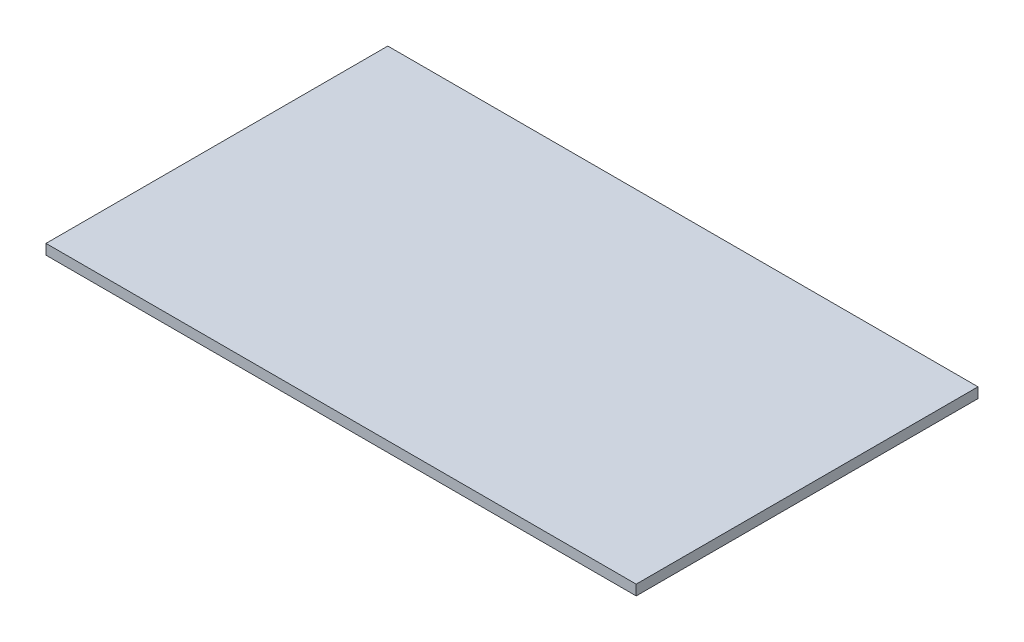
ISO-10303-21;
HEADER;
FILE_DESCRIPTION(('STEP AP214'),'2;1');
FILE_NAME('part.step','',(''),(''),'','','');
FILE_SCHEMA(('AUTOMOTIVE_DESIGN { 1 0 10303 214 1 1 1 1 }'));
ENDSEC;
DATA;
#1=APPLICATION_CONTEXT('core data for automotive mechanical design processes');
#2=APPLICATION_PROTOCOL_DEFINITION('international standard','automotive_design',2000,#1);
#3=PRODUCT_CONTEXT('',#1,'mechanical');
#4=PRODUCT('Part','Part','',(#3));
#5=PRODUCT_RELATED_PRODUCT_CATEGORY('part','',(#4));
#6=PRODUCT_DEFINITION_FORMATION('','',#4);
#7=PRODUCT_DEFINITION_CONTEXT('part definition',#1,'design');
#8=PRODUCT_DEFINITION('design','',#6,#7);
#9=PRODUCT_DEFINITION_SHAPE('','',#8);
#10=(LENGTH_UNIT() NAMED_UNIT(*) SI_UNIT(.MILLI.,.METRE.));
#11=(NAMED_UNIT(*) PLANE_ANGLE_UNIT() SI_UNIT($,.RADIAN.));
#12=(NAMED_UNIT(*) SI_UNIT($,.STERADIAN.) SOLID_ANGLE_UNIT());
#13=UNCERTAINTY_MEASURE_WITH_UNIT(LENGTH_MEASURE(1.E-05),#10,'distance_accuracy_value','');
#14=(GEOMETRIC_REPRESENTATION_CONTEXT(3) GLOBAL_UNCERTAINTY_ASSIGNED_CONTEXT((#13)) GLOBAL_UNIT_ASSIGNED_CONTEXT((#10,
#11,#12)) REPRESENTATION_CONTEXT('',''));
#15=CARTESIAN_POINT('',(0.,0.,0.));
#16=DIRECTION('',(0.,0.,1.));
#17=DIRECTION('',(1.,0.,0.));
#18=AXIS2_PLACEMENT_3D('',#15,#16,#17);
#19=CARTESIAN_POINT('',(518.,18.,-300.));
#20=DIRECTION('',(-1.,0.,0.));
#21=DIRECTION('',(0.,0.,1.));
#22=AXIS2_PLACEMENT_3D('',#19,#20,#21);
#23=PLANE('',#22);
#24=DIRECTION('',(0.,0.,-1.));
#25=VECTOR('',#24,1.);
#26=CARTESIAN_POINT('',(518.,0.,-300.));
#27=LINE('',#26,#25);
#28=CARTESIAN_POINT('',(518.,0.,300.));
#29=VERTEX_POINT('',#28);
#30=CARTESIAN_POINT('',(518.,0.,-300.));
#31=VERTEX_POINT('',#30);
#32=EDGE_CURVE('E96',#29,#31,#27,.T.);
#33=ORIENTED_EDGE('',*,*,#32,.T.);
#34=DIRECTION('',(0.,-1.,0.));
#35=VECTOR('',#34,1.);
#36=CARTESIAN_POINT('',(518.,18.,-300.));
#37=LINE('',#36,#35);
#38=CARTESIAN_POINT('',(518.,18.,-300.));
#39=VERTEX_POINT('',#38);
#40=EDGE_CURVE('E11',#39,#31,#37,.T.);
#41=ORIENTED_EDGE('',*,*,#40,.F.);
#42=DIRECTION('',(0.,0.,-1.));
#43=VECTOR('',#42,1.);
#44=CARTESIAN_POINT('',(518.,18.,-300.));
#45=LINE('',#44,#43);
#46=CARTESIAN_POINT('',(518.,18.,300.));
#47=VERTEX_POINT('',#46);
#48=EDGE_CURVE('E84',#47,#39,#45,.T.);
#49=ORIENTED_EDGE('',*,*,#48,.F.);
#50=DIRECTION('',(0.,-1.,0.));
#51=VECTOR('',#50,1.);
#52=CARTESIAN_POINT('',(518.,18.,300.));
#53=LINE('',#52,#51);
#54=EDGE_CURVE('E92',#47,#29,#53,.T.);
#55=ORIENTED_EDGE('',*,*,#54,.T.);
#56=EDGE_LOOP('',(#33,#41,#49,#55));
#57=FACE_BOUND('',#56,.T.);
#58=ADVANCED_FACE('F33',(#57),#23,.F.);
#59=CARTESIAN_POINT('',(-518.,18.,-300.));
#60=DIRECTION('',(0.,0.,1.));
#61=DIRECTION('',(1.,0.,0.));
#62=AXIS2_PLACEMENT_3D('',#59,#60,#61);
#63=PLANE('',#62);
#64=DIRECTION('',(-1.,0.,0.));
#65=VECTOR('',#64,1.);
#66=CARTESIAN_POINT('',(-518.,0.,-300.));
#67=LINE('',#66,#65);
#68=CARTESIAN_POINT('',(-518.,0.,-300.));
#69=VERTEX_POINT('',#68);
#70=EDGE_CURVE('E88',#31,#69,#67,.T.);
#71=ORIENTED_EDGE('',*,*,#70,.T.);
#72=DIRECTION('',(0.,-1.,0.));
#73=VECTOR('',#72,1.);
#74=CARTESIAN_POINT('',(-518.,18.,-300.));
#75=LINE('',#74,#73);
#76=CARTESIAN_POINT('',(-518.,18.,-300.));
#77=VERTEX_POINT('',#76);
#78=EDGE_CURVE('E41',#77,#69,#75,.T.);
#79=ORIENTED_EDGE('',*,*,#78,.F.);
#80=DIRECTION('',(-1.,0.,0.));
#81=VECTOR('',#80,1.);
#82=CARTESIAN_POINT('',(-518.,18.,-300.));
#83=LINE('',#82,#81);
#84=EDGE_CURVE('E79',#39,#77,#83,.T.);
#85=ORIENTED_EDGE('',*,*,#84,.F.);
#86=ORIENTED_EDGE('',*,*,#40,.T.);
#87=EDGE_LOOP('',(#71,#79,#85,#86));
#88=FACE_BOUND('',#87,.T.);
#89=ADVANCED_FACE('F87',(#88),#63,.F.);
#90=CARTESIAN_POINT('',(-518.,18.,-300.));
#91=DIRECTION('',(1.,0.,0.));
#92=DIRECTION('',(0.,0.,-1.));
#93=AXIS2_PLACEMENT_3D('',#90,#91,#92);
#94=PLANE('',#93);
#95=DIRECTION('',(0.,0.,1.));
#96=VECTOR('',#95,1.);
#97=CARTESIAN_POINT('',(-518.,0.,-300.));
#98=LINE('',#97,#96);
#99=CARTESIAN_POINT('',(-518.,0.,300.));
#100=VERTEX_POINT('',#99);
#101=EDGE_CURVE('E66',#69,#100,#98,.T.);
#102=ORIENTED_EDGE('',*,*,#101,.T.);
#103=DIRECTION('',(0.,-1.,0.));
#104=VECTOR('',#103,1.);
#105=CARTESIAN_POINT('',(-518.,18.,300.));
#106=LINE('',#105,#104);
#107=CARTESIAN_POINT('',(-518.,18.,300.));
#108=VERTEX_POINT('',#107);
#109=EDGE_CURVE('E89',#108,#100,#106,.T.);
#110=ORIENTED_EDGE('',*,*,#109,.F.);
#111=DIRECTION('',(0.,0.,1.));
#112=VECTOR('',#111,1.);
#113=CARTESIAN_POINT('',(-518.,18.,-300.));
#114=LINE('',#113,#112);
#115=EDGE_CURVE('E82',#77,#108,#114,.T.);
#116=ORIENTED_EDGE('',*,*,#115,.F.);
#117=ORIENTED_EDGE('',*,*,#78,.T.);
#118=EDGE_LOOP('',(#102,#110,#116,#117));
#119=FACE_BOUND('',#118,.T.);
#120=ADVANCED_FACE('F90',(#119),#94,.F.);
#121=CARTESIAN_POINT('',(-518.,18.,300.));
#122=DIRECTION('',(0.,0.,-1.));
#123=DIRECTION('',(-1.,0.,0.));
#124=AXIS2_PLACEMENT_3D('',#121,#122,#123);
#125=PLANE('',#124);
#126=DIRECTION('',(1.,0.,0.));
#127=VECTOR('',#126,1.);
#128=CARTESIAN_POINT('',(-518.,0.,300.));
#129=LINE('',#128,#127);
#130=EDGE_CURVE('E72',#100,#29,#129,.T.);
#131=ORIENTED_EDGE('',*,*,#130,.T.);
#132=ORIENTED_EDGE('',*,*,#54,.F.);
#133=DIRECTION('',(1.,0.,0.));
#134=VECTOR('',#133,1.);
#135=CARTESIAN_POINT('',(-518.,18.,300.));
#136=LINE('',#135,#134);
#137=EDGE_CURVE('E49',#108,#47,#136,.T.);
#138=ORIENTED_EDGE('',*,*,#137,.F.);
#139=ORIENTED_EDGE('',*,*,#109,.T.);
#140=EDGE_LOOP('',(#131,#132,#138,#139));
#141=FACE_BOUND('',#140,.T.);
#142=ADVANCED_FACE('F103',(#141),#125,.F.);
#143=CARTESIAN_POINT('',(0.,18.,0.));
#144=DIRECTION('',(0.,1.,0.));
#145=DIRECTION('',(0.,0.,1.));
#146=AXIS2_PLACEMENT_3D('',#143,#144,#145);
#147=PLANE('',#146);
#148=ORIENTED_EDGE('',*,*,#48,.T.);
#149=ORIENTED_EDGE('',*,*,#84,.T.);
#150=ORIENTED_EDGE('',*,*,#115,.T.);
#151=ORIENTED_EDGE('',*,*,#137,.T.);
#152=EDGE_LOOP('',(#148,#149,#150,#151));
#153=FACE_BOUND('',#152,.T.);
#154=ADVANCED_FACE('F80',(#153),#147,.T.);
#155=CARTESIAN_POINT('',(0.,0.,0.));
#156=DIRECTION('',(0.,1.,0.));
#157=DIRECTION('',(0.,0.,1.));
#158=AXIS2_PLACEMENT_3D('',#155,#156,#157);
#159=PLANE('',#158);
#160=ORIENTED_EDGE('',*,*,#32,.F.);
#161=ORIENTED_EDGE('',*,*,#130,.F.);
#162=ORIENTED_EDGE('',*,*,#101,.F.);
#163=ORIENTED_EDGE('',*,*,#70,.F.);
#164=EDGE_LOOP('',(#160,#161,#162,#163));
#165=FACE_BOUND('',#164,.T.);
#166=ADVANCED_FACE('F106',(#165),#159,.F.);
#167=CLOSED_SHELL('',(#58,#89,#120,#142,#154,#166));
#168=MANIFOLD_SOLID_BREP('B2',#167);
#169=ADVANCED_BREP_SHAPE_REPRESENTATION('',(#18,#168),#14);
#170=SHAPE_DEFINITION_REPRESENTATION(#9,#169);
ENDSEC;
END-ISO-10303-21;
